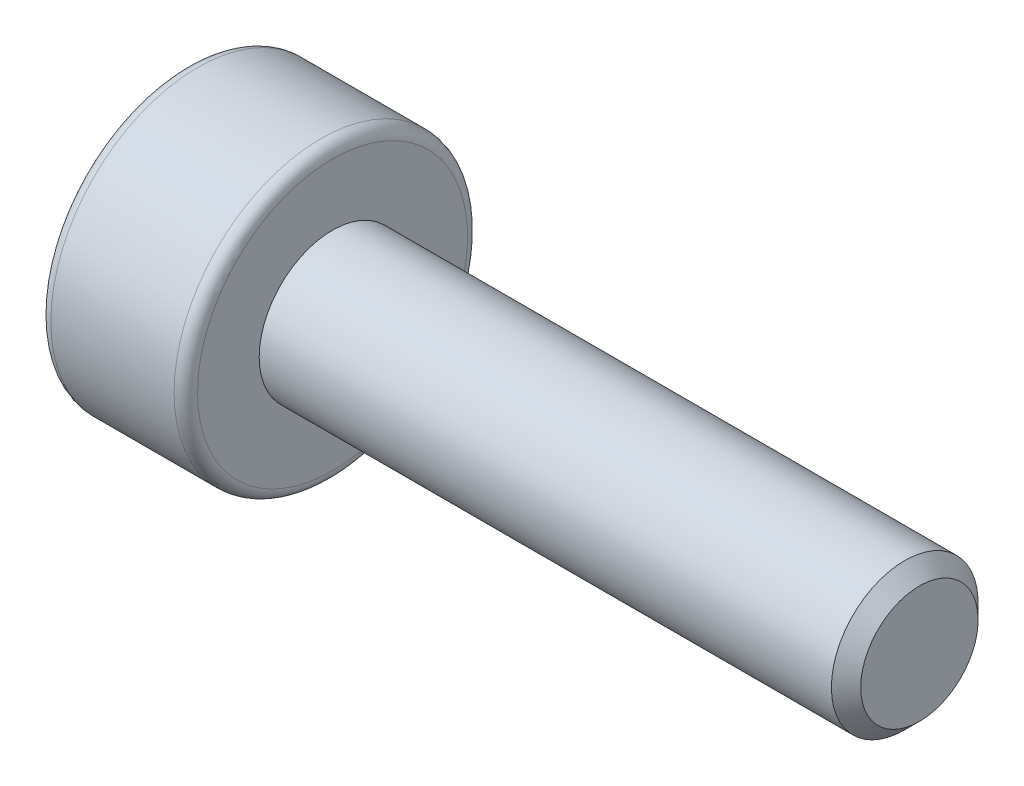
ISO-10303-21;
HEADER;
FILE_DESCRIPTION(('STEP AP214'),'2;1');
FILE_NAME('part.step','',(''),(''),'','','');
FILE_SCHEMA(('AUTOMOTIVE_DESIGN { 1 0 10303 214 1 1 1 1 }'));
ENDSEC;
DATA;
#1=APPLICATION_CONTEXT('core data for automotive mechanical design processes');
#2=APPLICATION_PROTOCOL_DEFINITION('international standard','automotive_design',2000,#1);
#3=PRODUCT_CONTEXT('',#1,'mechanical');
#4=PRODUCT('Part','Part','',(#3));
#5=PRODUCT_RELATED_PRODUCT_CATEGORY('part','',(#4));
#6=PRODUCT_DEFINITION_FORMATION('','',#4);
#7=PRODUCT_DEFINITION_CONTEXT('part definition',#1,'design');
#8=PRODUCT_DEFINITION('design','',#6,#7);
#9=PRODUCT_DEFINITION_SHAPE('','',#8);
#10=(LENGTH_UNIT() NAMED_UNIT(*) SI_UNIT(.MILLI.,.METRE.));
#11=(NAMED_UNIT(*) PLANE_ANGLE_UNIT() SI_UNIT($,.RADIAN.));
#12=(NAMED_UNIT(*) SI_UNIT($,.STERADIAN.) SOLID_ANGLE_UNIT());
#13=UNCERTAINTY_MEASURE_WITH_UNIT(LENGTH_MEASURE(1.E-05),#10,'distance_accuracy_value','');
#14=(GEOMETRIC_REPRESENTATION_CONTEXT(3) GLOBAL_UNCERTAINTY_ASSIGNED_CONTEXT((#13)) GLOBAL_UNIT_ASSIGNED_CONTEXT((#10,
#11,#12)) REPRESENTATION_CONTEXT('',''));
#15=CARTESIAN_POINT('',(0.,0.,0.));
#16=DIRECTION('',(0.,0.,1.));
#17=DIRECTION('',(1.,0.,0.));
#18=AXIS2_PLACEMENT_3D('',#15,#16,#17);
#19=CARTESIAN_POINT('',(0.,0.,0.));
#20=DIRECTION('',(1.,0.,0.));
#21=DIRECTION('',(0.,0.,-1.));
#22=AXIS2_PLACEMENT_3D('',#19,#20,#21);
#23=PLANE('',#22);
#24=DIRECTION('',(0.,0.866025403784439,0.5));
#25=VECTOR('',#24,1.);
#26=CARTESIAN_POINT('',(0.,-1.,0.577350269189626));
#27=LINE('',#26,#25);
#28=CARTESIAN_POINT('',(0.,-1.,0.577350269189626));
#29=VERTEX_POINT('',#28);
#30=CARTESIAN_POINT('',(0.,0.,1.15470053837925));
#31=VERTEX_POINT('',#30);
#32=EDGE_CURVE('E120',#29,#31,#27,.T.);
#33=ORIENTED_EDGE('',*,*,#32,.F.);
#34=DIRECTION('',(0.,0.,1.));
#35=VECTOR('',#34,1.);
#36=CARTESIAN_POINT('',(0.,-1.,-0.577350269189626));
#37=LINE('',#36,#35);
#38=CARTESIAN_POINT('',(0.,-1.,-0.577350269189626));
#39=VERTEX_POINT('',#38);
#40=EDGE_CURVE('E46',#39,#29,#37,.T.);
#41=ORIENTED_EDGE('',*,*,#40,.F.);
#42=DIRECTION('',(0.,-0.866025403784439,0.5));
#43=VECTOR('',#42,1.);
#44=CARTESIAN_POINT('',(0.,0.,-1.15470053837925));
#45=LINE('',#44,#43);
#46=CARTESIAN_POINT('',(0.,0.,-1.15470053837925));
#47=VERTEX_POINT('',#46);
#48=EDGE_CURVE('E129',#47,#39,#45,.T.);
#49=ORIENTED_EDGE('',*,*,#48,.F.);
#50=DIRECTION('',(0.,-0.866025403784439,-0.5));
#51=VECTOR('',#50,1.);
#52=CARTESIAN_POINT('',(0.,1.,-0.577350269189626));
#53=LINE('',#52,#51);
#54=CARTESIAN_POINT('',(0.,1.,-0.577350269189626));
#55=VERTEX_POINT('',#54);
#56=EDGE_CURVE('E127',#55,#47,#53,.T.);
#57=ORIENTED_EDGE('',*,*,#56,.F.);
#58=DIRECTION('',(0.,0.,-1.));
#59=VECTOR('',#58,1.);
#60=CARTESIAN_POINT('',(0.,1.,0.577350269189625));
#61=LINE('',#60,#59);
#62=CARTESIAN_POINT('',(0.,1.,0.577350269189625));
#63=VERTEX_POINT('',#62);
#64=EDGE_CURVE('E94',#63,#55,#61,.T.);
#65=ORIENTED_EDGE('',*,*,#64,.F.);
#66=DIRECTION('',(0.,0.866025403784438,-0.5));
#67=VECTOR('',#66,1.);
#68=CARTESIAN_POINT('',(0.,0.,1.15470053837925));
#69=LINE('',#68,#67);
#70=EDGE_CURVE('E123',#31,#63,#69,.T.);
#71=ORIENTED_EDGE('',*,*,#70,.F.);
#72=EDGE_LOOP('',(#33,#41,#49,#57,#65,#71));
#73=FACE_BOUND('',#72,.T.);
#74=CARTESIAN_POINT('',(0.,0.,0.));
#75=DIRECTION('',(-1.,0.,0.));
#76=DIRECTION('',(0.,0.,1.));
#77=AXIS2_PLACEMENT_3D('',#74,#75,#76);
#78=CIRCLE('',#77,2.3);
#79=CARTESIAN_POINT('',(0.,0.,2.3));
#80=VERTEX_POINT('',#79);
#81=EDGE_CURVE('E11',#80,#80,#78,.T.);
#82=ORIENTED_EDGE('',*,*,#81,.T.);
#83=EDGE_LOOP('',(#82));
#84=FACE_BOUND('',#83,.T.);
#85=ADVANCED_FACE('F32',(#73,#84),#23,.F.);
#86=CARTESIAN_POINT('',(0.2,0.,0.));
#87=DIRECTION('',(-1.,0.,0.));
#88=DIRECTION('',(0.,0.,1.));
#89=AXIS2_PLACEMENT_3D('',#86,#87,#88);
#90=TOROIDAL_SURFACE('',#89,2.3,0.2);
#91=ORIENTED_EDGE('',*,*,#81,.F.);
#92=EDGE_LOOP('',(#91));
#93=FACE_BOUND('',#92,.T.);
#94=CARTESIAN_POINT('',(0.2,0.,0.));
#95=DIRECTION('',(-1.,0.,0.));
#96=DIRECTION('',(0.,0.,1.));
#97=AXIS2_PLACEMENT_3D('',#94,#95,#96);
#98=CIRCLE('',#97,2.5);
#99=CARTESIAN_POINT('',(0.2,0.,2.5));
#100=VERTEX_POINT('',#99);
#101=EDGE_CURVE('E39',#100,#100,#98,.T.);
#102=ORIENTED_EDGE('',*,*,#101,.T.);
#103=EDGE_LOOP('',(#102));
#104=FACE_BOUND('',#103,.T.);
#105=ADVANCED_FACE('F155',(#93,#104),#90,.T.);
#106=CARTESIAN_POINT('',(-2.28184155946539,0.,0.));
#107=DIRECTION('',(-1.,0.,0.));
#108=DIRECTION('',(0.,0.,1.));
#109=AXIS2_PLACEMENT_3D('',#106,#107,#108);
#110=CYLINDRICAL_SURFACE('',#109,2.5);
#111=ORIENTED_EDGE('',*,*,#101,.F.);
#112=EDGE_LOOP('',(#111));
#113=FACE_BOUND('',#112,.T.);
#114=CARTESIAN_POINT('',(2.3,0.,0.));
#115=DIRECTION('',(-1.,0.,0.));
#116=DIRECTION('',(0.,0.,1.));
#117=AXIS2_PLACEMENT_3D('',#114,#115,#116);
#118=CIRCLE('',#117,2.5);
#119=CARTESIAN_POINT('',(2.3,0.,2.5));
#120=VERTEX_POINT('',#119);
#121=EDGE_CURVE('E150',#120,#120,#118,.T.);
#122=ORIENTED_EDGE('',*,*,#121,.T.);
#123=EDGE_LOOP('',(#122));
#124=FACE_BOUND('',#123,.T.);
#125=ADVANCED_FACE('F157',(#113,#124),#110,.T.);
#126=CARTESIAN_POINT('',(2.3,0.,0.));
#127=DIRECTION('',(-1.,0.,0.));
#128=DIRECTION('',(0.,0.,1.));
#129=AXIS2_PLACEMENT_3D('',#126,#127,#128);
#130=TOROIDAL_SURFACE('',#129,2.3,0.2);
#131=ORIENTED_EDGE('',*,*,#121,.F.);
#132=EDGE_LOOP('',(#131));
#133=FACE_BOUND('',#132,.T.);
#134=CARTESIAN_POINT('',(2.5,0.,0.));
#135=DIRECTION('',(-1.,0.,0.));
#136=DIRECTION('',(0.,0.,1.));
#137=AXIS2_PLACEMENT_3D('',#134,#135,#136);
#138=CIRCLE('',#137,2.3);
#139=CARTESIAN_POINT('',(2.5,0.,2.3));
#140=VERTEX_POINT('',#139);
#141=EDGE_CURVE('E147',#140,#140,#138,.T.);
#142=ORIENTED_EDGE('',*,*,#141,.T.);
#143=EDGE_LOOP('',(#142));
#144=FACE_BOUND('',#143,.T.);
#145=ADVANCED_FACE('F160',(#133,#144),#130,.T.);
#146=CARTESIAN_POINT('',(2.5,1.25,0.));
#147=DIRECTION('',(-1.,0.,0.));
#148=DIRECTION('',(0.,0.,1.));
#149=AXIS2_PLACEMENT_3D('',#146,#147,#148);
#150=PLANE('',#149);
#151=ORIENTED_EDGE('',*,*,#141,.F.);
#152=EDGE_LOOP('',(#151));
#153=FACE_BOUND('',#152,.T.);
#154=CARTESIAN_POINT('',(2.5,0.,0.));
#155=DIRECTION('',(-1.,0.,0.));
#156=DIRECTION('',(0.,0.,1.));
#157=AXIS2_PLACEMENT_3D('',#154,#155,#156);
#158=CIRCLE('',#157,1.25);
#159=CARTESIAN_POINT('',(2.5,0.,1.25));
#160=VERTEX_POINT('',#159);
#161=EDGE_CURVE('E144',#160,#160,#158,.T.);
#162=ORIENTED_EDGE('',*,*,#161,.T.);
#163=EDGE_LOOP('',(#162));
#164=FACE_BOUND('',#163,.T.);
#165=ADVANCED_FACE('F166',(#153,#164),#150,.F.);
#166=CARTESIAN_POINT('',(-2.28184155946539,0.,0.));
#167=DIRECTION('',(-1.,0.,0.));
#168=DIRECTION('',(0.,0.,1.));
#169=AXIS2_PLACEMENT_3D('',#166,#167,#168);
#170=CYLINDRICAL_SURFACE('',#169,1.25);
#171=ORIENTED_EDGE('',*,*,#161,.F.);
#172=EDGE_LOOP('',(#171));
#173=FACE_BOUND('',#172,.T.);
#174=CARTESIAN_POINT('',(12.25,0.,0.));
#175=DIRECTION('',(-1.,0.,0.));
#176=DIRECTION('',(0.,0.,1.));
#177=AXIS2_PLACEMENT_3D('',#174,#175,#176);
#178=CIRCLE('',#177,1.25);
#179=CARTESIAN_POINT('',(12.25,0.,1.25));
#180=VERTEX_POINT('',#179);
#181=EDGE_CURVE('E141',#180,#180,#178,.T.);
#182=ORIENTED_EDGE('',*,*,#181,.T.);
#183=EDGE_LOOP('',(#182));
#184=FACE_BOUND('',#183,.T.);
#185=ADVANCED_FACE('F172',(#173,#184),#170,.T.);
#186=CARTESIAN_POINT('',(12.5,0.,0.));
#187=DIRECTION('',(-1.,0.,0.));
#188=DIRECTION('',(0.,0.,1.));
#189=AXIS2_PLACEMENT_3D('',#186,#187,#188);
#190=CONICAL_SURFACE('',#189,1.,0.785398163397451);
#191=ORIENTED_EDGE('',*,*,#181,.F.);
#192=EDGE_LOOP('',(#191));
#193=FACE_BOUND('',#192,.T.);
#194=CARTESIAN_POINT('',(12.5,0.,0.));
#195=DIRECTION('',(-1.,0.,0.));
#196=DIRECTION('',(0.,0.,1.));
#197=AXIS2_PLACEMENT_3D('',#194,#195,#196);
#198=CIRCLE('',#197,1.);
#199=CARTESIAN_POINT('',(12.5,0.,1.));
#200=VERTEX_POINT('',#199);
#201=EDGE_CURVE('E133',#200,#200,#198,.T.);
#202=ORIENTED_EDGE('',*,*,#201,.T.);
#203=EDGE_LOOP('',(#202));
#204=FACE_BOUND('',#203,.T.);
#205=ADVANCED_FACE('F178',(#193,#204),#190,.T.);
#206=CARTESIAN_POINT('',(12.5,1.,0.));
#207=DIRECTION('',(-1.,0.,0.));
#208=DIRECTION('',(0.,0.,1.));
#209=AXIS2_PLACEMENT_3D('',#206,#207,#208);
#210=PLANE('',#209);
#211=ORIENTED_EDGE('',*,*,#201,.F.);
#212=EDGE_LOOP('',(#211));
#213=FACE_BOUND('',#212,.T.);
#214=ADVANCED_FACE('F184',(#213),#210,.F.);
#215=CARTESIAN_POINT('',(0.8,-1.,-0.577350269189626));
#216=DIRECTION('',(0.,-1.,0.));
#217=DIRECTION('',(0.,0.,-1.));
#218=AXIS2_PLACEMENT_3D('',#215,#216,#217);
#219=PLANE('',#218);
#220=ORIENTED_EDGE('',*,*,#40,.T.);
#221=DIRECTION('',(-1.,0.,0.));
#222=VECTOR('',#221,1.);
#223=CARTESIAN_POINT('',(0.8,-1.,0.577350269189626));
#224=LINE('',#223,#222);
#225=CARTESIAN_POINT('',(0.8,-1.,0.577350269189626));
#226=VERTEX_POINT('',#225);
#227=EDGE_CURVE('E76',#226,#29,#224,.T.);
#228=ORIENTED_EDGE('',*,*,#227,.F.);
#229=DIRECTION('',(0.,0.,1.));
#230=VECTOR('',#229,1.);
#231=CARTESIAN_POINT('',(0.8,-1.,-0.577350269189626));
#232=LINE('',#231,#230);
#233=CARTESIAN_POINT('',(0.8,-1.,-0.577350269189626));
#234=VERTEX_POINT('',#233);
#235=EDGE_CURVE('E131',#234,#226,#232,.T.);
#236=ORIENTED_EDGE('',*,*,#235,.F.);
#237=DIRECTION('',(-1.,0.,0.));
#238=VECTOR('',#237,1.);
#239=CARTESIAN_POINT('',(0.8,-1.,-0.577350269189626));
#240=LINE('',#239,#238);
#241=EDGE_CURVE('E54',#234,#39,#240,.T.);
#242=ORIENTED_EDGE('',*,*,#241,.T.);
#243=EDGE_LOOP('',(#220,#228,#236,#242));
#244=FACE_BOUND('',#243,.T.);
#245=ADVANCED_FACE('F189',(#244),#219,.F.);
#246=CARTESIAN_POINT('',(0.8,0.,-1.15470053837925));
#247=DIRECTION('',(0.,-0.5,-0.866025403784439));
#248=DIRECTION('',(0.,0.866025403784439,-0.5));
#249=AXIS2_PLACEMENT_3D('',#246,#247,#248);
#250=PLANE('',#249);
#251=ORIENTED_EDGE('',*,*,#48,.T.);
#252=ORIENTED_EDGE('',*,*,#241,.F.);
#253=DIRECTION('',(0.,-0.866025403784439,0.5));
#254=VECTOR('',#253,1.);
#255=CARTESIAN_POINT('',(0.8,0.,-1.15470053837925));
#256=LINE('',#255,#254);
#257=CARTESIAN_POINT('',(0.8,0.,-1.15470053837925));
#258=VERTEX_POINT('',#257);
#259=EDGE_CURVE('E106',#258,#234,#256,.T.);
#260=ORIENTED_EDGE('',*,*,#259,.F.);
#261=DIRECTION('',(-1.,0.,0.));
#262=VECTOR('',#261,1.);
#263=CARTESIAN_POINT('',(0.8,0.,-1.15470053837925));
#264=LINE('',#263,#262);
#265=EDGE_CURVE('E98',#258,#47,#264,.T.);
#266=ORIENTED_EDGE('',*,*,#265,.T.);
#267=EDGE_LOOP('',(#251,#252,#260,#266));
#268=FACE_BOUND('',#267,.T.);
#269=ADVANCED_FACE('F194',(#268),#250,.F.);
#270=CARTESIAN_POINT('',(0.8,1.,-0.577350269189626));
#271=DIRECTION('',(0.,0.5,-0.866025403784439));
#272=DIRECTION('',(0.,0.866025403784439,0.5));
#273=AXIS2_PLACEMENT_3D('',#270,#271,#272);
#274=PLANE('',#273);
#275=ORIENTED_EDGE('',*,*,#56,.T.);
#276=ORIENTED_EDGE('',*,*,#265,.F.);
#277=DIRECTION('',(0.,-0.866025403784439,-0.5));
#278=VECTOR('',#277,1.);
#279=CARTESIAN_POINT('',(0.8,1.,-0.577350269189626));
#280=LINE('',#279,#278);
#281=CARTESIAN_POINT('',(0.8,1.,-0.577350269189626));
#282=VERTEX_POINT('',#281);
#283=EDGE_CURVE('E102',#282,#258,#280,.T.);
#284=ORIENTED_EDGE('',*,*,#283,.F.);
#285=DIRECTION('',(-1.,0.,0.));
#286=VECTOR('',#285,1.);
#287=CARTESIAN_POINT('',(0.8,1.,-0.577350269189626));
#288=LINE('',#287,#286);
#289=EDGE_CURVE('E87',#282,#55,#288,.T.);
#290=ORIENTED_EDGE('',*,*,#289,.T.);
#291=EDGE_LOOP('',(#275,#276,#284,#290));
#292=FACE_BOUND('',#291,.T.);
#293=ADVANCED_FACE('F103',(#292),#274,.F.);
#294=CARTESIAN_POINT('',(0.8,1.,0.577350269189625));
#295=DIRECTION('',(0.,1.,0.));
#296=DIRECTION('',(0.,0.,1.));
#297=AXIS2_PLACEMENT_3D('',#294,#295,#296);
#298=PLANE('',#297);
#299=ORIENTED_EDGE('',*,*,#64,.T.);
#300=ORIENTED_EDGE('',*,*,#289,.F.);
#301=DIRECTION('',(0.,0.,-1.));
#302=VECTOR('',#301,1.);
#303=CARTESIAN_POINT('',(0.8,1.,0.577350269189625));
#304=LINE('',#303,#302);
#305=CARTESIAN_POINT('',(0.8,1.,0.577350269189625));
#306=VERTEX_POINT('',#305);
#307=EDGE_CURVE('E91',#306,#282,#304,.T.);
#308=ORIENTED_EDGE('',*,*,#307,.F.);
#309=DIRECTION('',(-1.,0.,0.));
#310=VECTOR('',#309,1.);
#311=CARTESIAN_POINT('',(0.8,1.,0.577350269189625));
#312=LINE('',#311,#310);
#313=EDGE_CURVE('E99',#306,#63,#312,.T.);
#314=ORIENTED_EDGE('',*,*,#313,.T.);
#315=EDGE_LOOP('',(#299,#300,#308,#314));
#316=FACE_BOUND('',#315,.T.);
#317=ADVANCED_FACE('F89',(#316),#298,.F.);
#318=CARTESIAN_POINT('',(0.8,0.,1.15470053837925));
#319=DIRECTION('',(0.,0.5,0.866025403784438));
#320=DIRECTION('',(0.,-0.866025403784439,0.5));
#321=AXIS2_PLACEMENT_3D('',#318,#319,#320);
#322=PLANE('',#321);
#323=ORIENTED_EDGE('',*,*,#70,.T.);
#324=ORIENTED_EDGE('',*,*,#313,.F.);
#325=DIRECTION('',(0.,0.866025403784438,-0.5));
#326=VECTOR('',#325,1.);
#327=CARTESIAN_POINT('',(0.8,0.,1.15470053837925));
#328=LINE('',#327,#326);
#329=CARTESIAN_POINT('',(0.8,0.,1.15470053837925));
#330=VERTEX_POINT('',#329);
#331=EDGE_CURVE('E112',#330,#306,#328,.T.);
#332=ORIENTED_EDGE('',*,*,#331,.F.);
#333=DIRECTION('',(-1.,0.,0.));
#334=VECTOR('',#333,1.);
#335=CARTESIAN_POINT('',(0.8,0.,1.15470053837925));
#336=LINE('',#335,#334);
#337=EDGE_CURVE('E136',#330,#31,#336,.T.);
#338=ORIENTED_EDGE('',*,*,#337,.T.);
#339=EDGE_LOOP('',(#323,#324,#332,#338));
#340=FACE_BOUND('',#339,.T.);
#341=ADVANCED_FACE('F220',(#340),#322,.F.);
#342=CARTESIAN_POINT('',(0.8,-1.,0.577350269189626));
#343=DIRECTION('',(0.,-0.5,0.866025403784439));
#344=DIRECTION('',(0.,-0.866025403784439,-0.5));
#345=AXIS2_PLACEMENT_3D('',#342,#343,#344);
#346=PLANE('',#345);
#347=ORIENTED_EDGE('',*,*,#32,.T.);
#348=ORIENTED_EDGE('',*,*,#337,.F.);
#349=DIRECTION('',(0.,0.866025403784439,0.5));
#350=VECTOR('',#349,1.);
#351=CARTESIAN_POINT('',(0.8,-1.,0.577350269189626));
#352=LINE('',#351,#350);
#353=EDGE_CURVE('E114',#226,#330,#352,.T.);
#354=ORIENTED_EDGE('',*,*,#353,.F.);
#355=ORIENTED_EDGE('',*,*,#227,.T.);
#356=EDGE_LOOP('',(#347,#348,#354,#355));
#357=FACE_BOUND('',#356,.T.);
#358=ADVANCED_FACE('F208',(#357),#346,.F.);
#359=CARTESIAN_POINT('',(0.8,0.,0.));
#360=DIRECTION('',(-1.,0.,0.));
#361=DIRECTION('',(0.,0.,1.));
#362=AXIS2_PLACEMENT_3D('',#359,#360,#361);
#363=PLANE('',#362);
#364=ORIENTED_EDGE('',*,*,#235,.T.);
#365=ORIENTED_EDGE('',*,*,#353,.T.);
#366=ORIENTED_EDGE('',*,*,#331,.T.);
#367=ORIENTED_EDGE('',*,*,#307,.T.);
#368=ORIENTED_EDGE('',*,*,#283,.T.);
#369=ORIENTED_EDGE('',*,*,#259,.T.);
#370=EDGE_LOOP('',(#364,#365,#366,#367,#368,#369));
#371=FACE_BOUND('',#370,.T.);
#372=ADVANCED_FACE('F109',(#371),#363,.T.);
#373=CLOSED_SHELL('',(#85,#105,#125,#145,#165,#185,#205,#214,#245,#269,#293,#317,#341,#358,#372));
#374=MANIFOLD_SOLID_BREP('B2',#373);
#375=ADVANCED_BREP_SHAPE_REPRESENTATION('',(#18,#374),#14);
#376=SHAPE_DEFINITION_REPRESENTATION(#9,#375);
ENDSEC;
END-ISO-10303-21;
